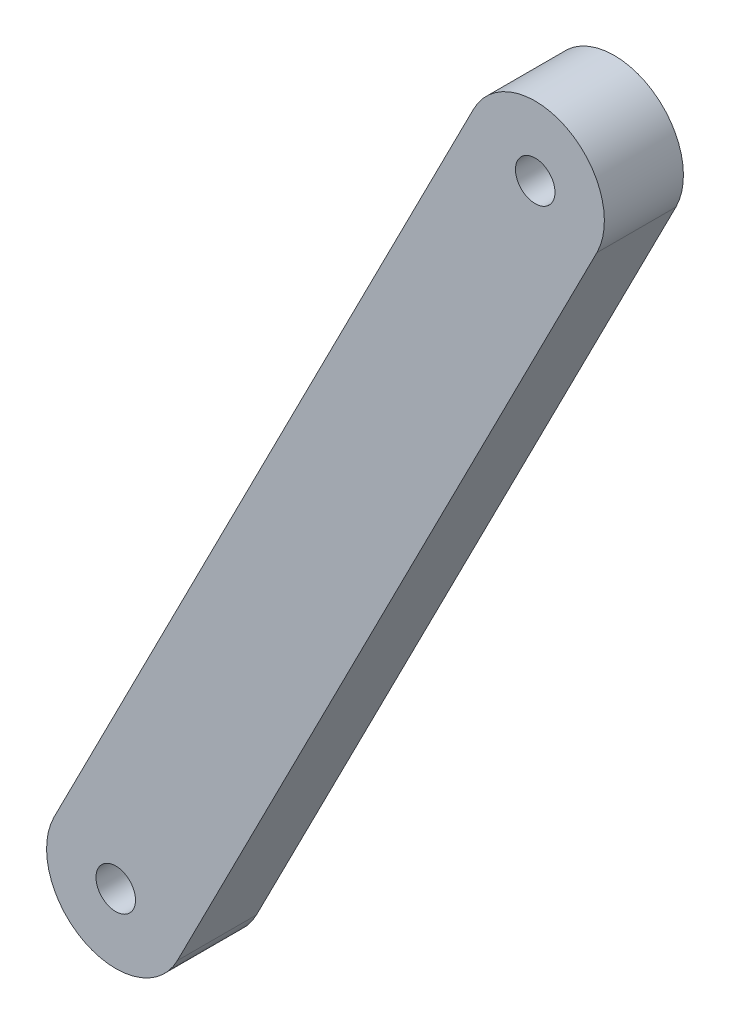
ISO-10303-21;
HEADER;
FILE_DESCRIPTION(('STEP AP214'),'2;1');
FILE_NAME('part.step','',(''),(''),'','','');
FILE_SCHEMA(('AUTOMOTIVE_DESIGN { 1 0 10303 214 1 1 1 1 }'));
ENDSEC;
DATA;
#1=APPLICATION_CONTEXT('core data for automotive mechanical design processes');
#2=APPLICATION_PROTOCOL_DEFINITION('international standard','automotive_design',2000,#1);
#3=PRODUCT_CONTEXT('',#1,'mechanical');
#4=PRODUCT('Part','Part','',(#3));
#5=PRODUCT_RELATED_PRODUCT_CATEGORY('part','',(#4));
#6=PRODUCT_DEFINITION_FORMATION('','',#4);
#7=PRODUCT_DEFINITION_CONTEXT('part definition',#1,'design');
#8=PRODUCT_DEFINITION('design','',#6,#7);
#9=PRODUCT_DEFINITION_SHAPE('','',#8);
#10=(LENGTH_UNIT() NAMED_UNIT(*) SI_UNIT(.MILLI.,.METRE.));
#11=(NAMED_UNIT(*) PLANE_ANGLE_UNIT() SI_UNIT($,.RADIAN.));
#12=(NAMED_UNIT(*) SI_UNIT($,.STERADIAN.) SOLID_ANGLE_UNIT());
#13=UNCERTAINTY_MEASURE_WITH_UNIT(LENGTH_MEASURE(1.E-05),#10,'distance_accuracy_value','');
#14=(GEOMETRIC_REPRESENTATION_CONTEXT(3) GLOBAL_UNCERTAINTY_ASSIGNED_CONTEXT((#13)) GLOBAL_UNIT_ASSIGNED_CONTEXT((#10,
#11,#12)) REPRESENTATION_CONTEXT('',''));
#15=CARTESIAN_POINT('',(0.,0.,0.));
#16=DIRECTION('',(0.,0.,1.));
#17=DIRECTION('',(1.,0.,0.));
#18=AXIS2_PLACEMENT_3D('',#15,#16,#17);
#19=CARTESIAN_POINT('',(0.,0.,4.));
#20=DIRECTION('',(0.,0.,1.));
#21=DIRECTION('',(1.,0.,0.));
#22=AXIS2_PLACEMENT_3D('',#19,#20,#21);
#23=PLANE('',#22);
#24=CARTESIAN_POINT('',(21.2293088241751,41.6403043955711,4.));
#25=DIRECTION('',(0.,0.,1.));
#26=DIRECTION('',(1.,0.,0.));
#27=AXIS2_PLACEMENT_3D('',#24,#25,#26);
#28=CIRCLE('',#27,1.);
#29=CARTESIAN_POINT('',(22.2293088241751,41.6403043955711,4.));
#30=VERTEX_POINT('',#29);
#31=EDGE_CURVE('E101',#30,#30,#28,.T.);
#32=ORIENTED_EDGE('',*,*,#31,.F.);
#33=EDGE_LOOP('',(#32));
#34=FACE_BOUND('',#33,.T.);
#35=CARTESIAN_POINT('',(0.,0.,4.));
#36=DIRECTION('',(0.,0.,1.));
#37=DIRECTION('',(1.,0.,0.));
#38=AXIS2_PLACEMENT_3D('',#35,#36,#37);
#39=CIRCLE('',#38,3.5);
#40=CARTESIAN_POINT('',(-3.11814368730659,1.58971064829738,4.));
#41=VERTEX_POINT('',#40);
#42=CARTESIAN_POINT('',(3.11814368730659,-1.58971064829738,4.));
#43=VERTEX_POINT('',#42);
#44=EDGE_CURVE('E86',#41,#43,#39,.T.);
#45=ORIENTED_EDGE('',*,*,#44,.T.);
#46=DIRECTION('',(0.45420304237068,0.890898196373311,0.));
#47=VECTOR('',#46,1.);
#48=CARTESIAN_POINT('',(3.11814368730659,-1.58971064829738,4.));
#49=LINE('',#48,#47);
#50=CARTESIAN_POINT('',(24.3474525114816,40.0505937472737,4.));
#51=VERTEX_POINT('',#50);
#52=EDGE_CURVE('E81',#43,#51,#49,.T.);
#53=ORIENTED_EDGE('',*,*,#52,.T.);
#54=CARTESIAN_POINT('',(21.2293088241751,41.6403043955711,4.));
#55=DIRECTION('',(0.,0.,1.));
#56=DIRECTION('',(1.,0.,0.));
#57=AXIS2_PLACEMENT_3D('',#54,#55,#56);
#58=CIRCLE('',#57,3.5);
#59=CARTESIAN_POINT('',(18.1111651368685,43.2300150438685,4.));
#60=VERTEX_POINT('',#59);
#61=EDGE_CURVE('E84',#51,#60,#58,.T.);
#62=ORIENTED_EDGE('',*,*,#61,.T.);
#63=DIRECTION('',(-0.45420304237068,-0.890898196373311,0.));
#64=VECTOR('',#63,1.);
#65=CARTESIAN_POINT('',(-3.11814368730659,1.58971064829738,4.));
#66=LINE('',#65,#64);
#67=EDGE_CURVE('E51',#60,#41,#66,.T.);
#68=ORIENTED_EDGE('',*,*,#67,.T.);
#69=EDGE_LOOP('',(#45,#53,#62,#68));
#70=FACE_BOUND('',#69,.T.);
#71=CARTESIAN_POINT('',(0.,0.,4.));
#72=DIRECTION('',(0.,0.,1.));
#73=DIRECTION('',(1.,0.,0.));
#74=AXIS2_PLACEMENT_3D('',#71,#72,#73);
#75=CIRCLE('',#74,1.);
#76=CARTESIAN_POINT('',(1.,0.,4.));
#77=VERTEX_POINT('',#76);
#78=EDGE_CURVE('E116',#77,#77,#75,.T.);
#79=ORIENTED_EDGE('',*,*,#78,.F.);
#80=EDGE_LOOP('',(#79));
#81=FACE_BOUND('',#80,.T.);
#82=ADVANCED_FACE('F34',(#34,#70,#81),#23,.T.);
#83=CARTESIAN_POINT('',(0.,0.,0.));
#84=DIRECTION('',(0.,0.,1.));
#85=DIRECTION('',(1.,0.,0.));
#86=AXIS2_PLACEMENT_3D('',#83,#84,#85);
#87=PLANE('',#86);
#88=CARTESIAN_POINT('',(0.,0.,0.));
#89=DIRECTION('',(0.,0.,1.));
#90=DIRECTION('',(1.,0.,0.));
#91=AXIS2_PLACEMENT_3D('',#88,#89,#90);
#92=CIRCLE('',#91,3.5);
#93=CARTESIAN_POINT('',(-3.11814368730659,1.58971064829738,0.));
#94=VERTEX_POINT('',#93);
#95=CARTESIAN_POINT('',(3.11814368730659,-1.58971064829738,0.));
#96=VERTEX_POINT('',#95);
#97=EDGE_CURVE('E98',#94,#96,#92,.T.);
#98=ORIENTED_EDGE('',*,*,#97,.F.);
#99=DIRECTION('',(-0.45420304237068,-0.890898196373311,0.));
#100=VECTOR('',#99,1.);
#101=CARTESIAN_POINT('',(-3.11814368730659,1.58971064829738,0.));
#102=LINE('',#101,#100);
#103=CARTESIAN_POINT('',(18.1111651368685,43.2300150438685,0.));
#104=VERTEX_POINT('',#103);
#105=EDGE_CURVE('E74',#104,#94,#102,.T.);
#106=ORIENTED_EDGE('',*,*,#105,.F.);
#107=CARTESIAN_POINT('',(21.2293088241751,41.6403043955711,0.));
#108=DIRECTION('',(0.,0.,1.));
#109=DIRECTION('',(1.,0.,0.));
#110=AXIS2_PLACEMENT_3D('',#107,#108,#109);
#111=CIRCLE('',#110,3.5);
#112=CARTESIAN_POINT('',(24.3474525114816,40.0505937472737,0.));
#113=VERTEX_POINT('',#112);
#114=EDGE_CURVE('E68',#113,#104,#111,.T.);
#115=ORIENTED_EDGE('',*,*,#114,.F.);
#116=DIRECTION('',(0.45420304237068,0.890898196373311,0.));
#117=VECTOR('',#116,1.);
#118=CARTESIAN_POINT('',(3.11814368730659,-1.58971064829738,0.));
#119=LINE('',#118,#117);
#120=EDGE_CURVE('E90',#96,#113,#119,.T.);
#121=ORIENTED_EDGE('',*,*,#120,.F.);
#122=EDGE_LOOP('',(#98,#106,#115,#121));
#123=FACE_BOUND('',#122,.T.);
#124=CARTESIAN_POINT('',(21.2293088241751,41.6403043955711,0.));
#125=DIRECTION('',(0.,0.,1.));
#126=DIRECTION('',(1.,0.,0.));
#127=AXIS2_PLACEMENT_3D('',#124,#125,#126);
#128=CIRCLE('',#127,1.);
#129=CARTESIAN_POINT('',(22.2293088241751,41.6403043955711,0.));
#130=VERTEX_POINT('',#129);
#131=EDGE_CURVE('E113',#130,#130,#128,.T.);
#132=ORIENTED_EDGE('',*,*,#131,.T.);
#133=EDGE_LOOP('',(#132));
#134=FACE_BOUND('',#133,.T.);
#135=CARTESIAN_POINT('',(0.,0.,0.));
#136=DIRECTION('',(0.,0.,1.));
#137=DIRECTION('',(1.,0.,0.));
#138=AXIS2_PLACEMENT_3D('',#135,#136,#137);
#139=CIRCLE('',#138,1.);
#140=CARTESIAN_POINT('',(1.,0.,0.));
#141=VERTEX_POINT('',#140);
#142=EDGE_CURVE('E119',#141,#141,#139,.T.);
#143=ORIENTED_EDGE('',*,*,#142,.T.);
#144=EDGE_LOOP('',(#143));
#145=FACE_BOUND('',#144,.T.);
#146=ADVANCED_FACE('F109',(#123,#134,#145),#87,.F.);
#147=CARTESIAN_POINT('',(0.,0.,4.));
#148=DIRECTION('',(0.,0.,-1.));
#149=DIRECTION('',(-1.,0.,0.));
#150=AXIS2_PLACEMENT_3D('',#147,#148,#149);
#151=CYLINDRICAL_SURFACE('',#150,3.5);
#152=ORIENTED_EDGE('',*,*,#97,.T.);
#153=DIRECTION('',(0.,0.,-1.));
#154=VECTOR('',#153,1.);
#155=CARTESIAN_POINT('',(3.11814368730659,-1.58971064829738,4.));
#156=LINE('',#155,#154);
#157=EDGE_CURVE('E11',#43,#96,#156,.T.);
#158=ORIENTED_EDGE('',*,*,#157,.F.);
#159=ORIENTED_EDGE('',*,*,#44,.F.);
#160=DIRECTION('',(0.,0.,-1.));
#161=VECTOR('',#160,1.);
#162=CARTESIAN_POINT('',(-3.11814368730659,1.58971064829738,4.));
#163=LINE('',#162,#161);
#164=EDGE_CURVE('E94',#41,#94,#163,.T.);
#165=ORIENTED_EDGE('',*,*,#164,.T.);
#166=EDGE_LOOP('',(#152,#158,#159,#165));
#167=FACE_BOUND('',#166,.T.);
#168=ADVANCED_FACE('F36',(#167),#151,.T.);
#169=CARTESIAN_POINT('',(3.11814368730659,-1.58971064829738,4.));
#170=DIRECTION('',(-0.890898196373311,0.45420304237068,0.));
#171=DIRECTION('',(-0.45420304237068,-0.890898196373311,0.));
#172=AXIS2_PLACEMENT_3D('',#169,#170,#171);
#173=PLANE('',#172);
#174=ORIENTED_EDGE('',*,*,#120,.T.);
#175=DIRECTION('',(0.,0.,-1.));
#176=VECTOR('',#175,1.);
#177=CARTESIAN_POINT('',(24.3474525114816,40.0505937472737,4.));
#178=LINE('',#177,#176);
#179=EDGE_CURVE('E43',#51,#113,#178,.T.);
#180=ORIENTED_EDGE('',*,*,#179,.F.);
#181=ORIENTED_EDGE('',*,*,#52,.F.);
#182=ORIENTED_EDGE('',*,*,#157,.T.);
#183=EDGE_LOOP('',(#174,#180,#181,#182));
#184=FACE_BOUND('',#183,.T.);
#185=ADVANCED_FACE('F89',(#184),#173,.F.);
#186=CARTESIAN_POINT('',(21.2293088241751,41.6403043955711,4.));
#187=DIRECTION('',(0.,0.,-1.));
#188=DIRECTION('',(-1.,0.,0.));
#189=AXIS2_PLACEMENT_3D('',#186,#187,#188);
#190=CYLINDRICAL_SURFACE('',#189,3.5);
#191=ORIENTED_EDGE('',*,*,#114,.T.);
#192=DIRECTION('',(0.,0.,-1.));
#193=VECTOR('',#192,1.);
#194=CARTESIAN_POINT('',(18.1111651368685,43.2300150438685,4.));
#195=LINE('',#194,#193);
#196=EDGE_CURVE('E91',#60,#104,#195,.T.);
#197=ORIENTED_EDGE('',*,*,#196,.F.);
#198=ORIENTED_EDGE('',*,*,#61,.F.);
#199=ORIENTED_EDGE('',*,*,#179,.T.);
#200=EDGE_LOOP('',(#191,#197,#198,#199));
#201=FACE_BOUND('',#200,.T.);
#202=ADVANCED_FACE('F92',(#201),#190,.T.);
#203=CARTESIAN_POINT('',(-3.11814368730659,1.58971064829738,4.));
#204=DIRECTION('',(0.890898196373311,-0.45420304237068,0.));
#205=DIRECTION('',(0.45420304237068,0.890898196373311,0.));
#206=AXIS2_PLACEMENT_3D('',#203,#204,#205);
#207=PLANE('',#206);
#208=ORIENTED_EDGE('',*,*,#105,.T.);
#209=ORIENTED_EDGE('',*,*,#164,.F.);
#210=ORIENTED_EDGE('',*,*,#67,.F.);
#211=ORIENTED_EDGE('',*,*,#196,.T.);
#212=EDGE_LOOP('',(#208,#209,#210,#211));
#213=FACE_BOUND('',#212,.T.);
#214=ADVANCED_FACE('F106',(#213),#207,.F.);
#215=CARTESIAN_POINT('',(21.2293088241751,41.6403043955711,4.));
#216=DIRECTION('',(0.,0.,-1.));
#217=DIRECTION('',(-1.,0.,0.));
#218=AXIS2_PLACEMENT_3D('',#215,#216,#217);
#219=CYLINDRICAL_SURFACE('',#218,1.);
#220=ORIENTED_EDGE('',*,*,#31,.T.);
#221=EDGE_LOOP('',(#220));
#222=FACE_BOUND('',#221,.T.);
#223=ORIENTED_EDGE('',*,*,#131,.F.);
#224=EDGE_LOOP('',(#223));
#225=FACE_BOUND('',#224,.T.);
#226=ADVANCED_FACE('F136',(#222,#225),#219,.F.);
#227=CARTESIAN_POINT('',(0.,0.,4.));
#228=DIRECTION('',(0.,0.,-1.));
#229=DIRECTION('',(-1.,0.,0.));
#230=AXIS2_PLACEMENT_3D('',#227,#228,#229);
#231=CYLINDRICAL_SURFACE('',#230,1.);
#232=ORIENTED_EDGE('',*,*,#78,.T.);
#233=EDGE_LOOP('',(#232));
#234=FACE_BOUND('',#233,.T.);
#235=ORIENTED_EDGE('',*,*,#142,.F.);
#236=EDGE_LOOP('',(#235));
#237=FACE_BOUND('',#236,.T.);
#238=ADVANCED_FACE('F125',(#234,#237),#231,.F.);
#239=CLOSED_SHELL('',(#82,#146,#168,#185,#202,#214,#226,#238));
#240=MANIFOLD_SOLID_BREP('B2',#239);
#241=ADVANCED_BREP_SHAPE_REPRESENTATION('',(#18,#240),#14);
#242=SHAPE_DEFINITION_REPRESENTATION(#9,#241);
ENDSEC;
END-ISO-10303-21;
